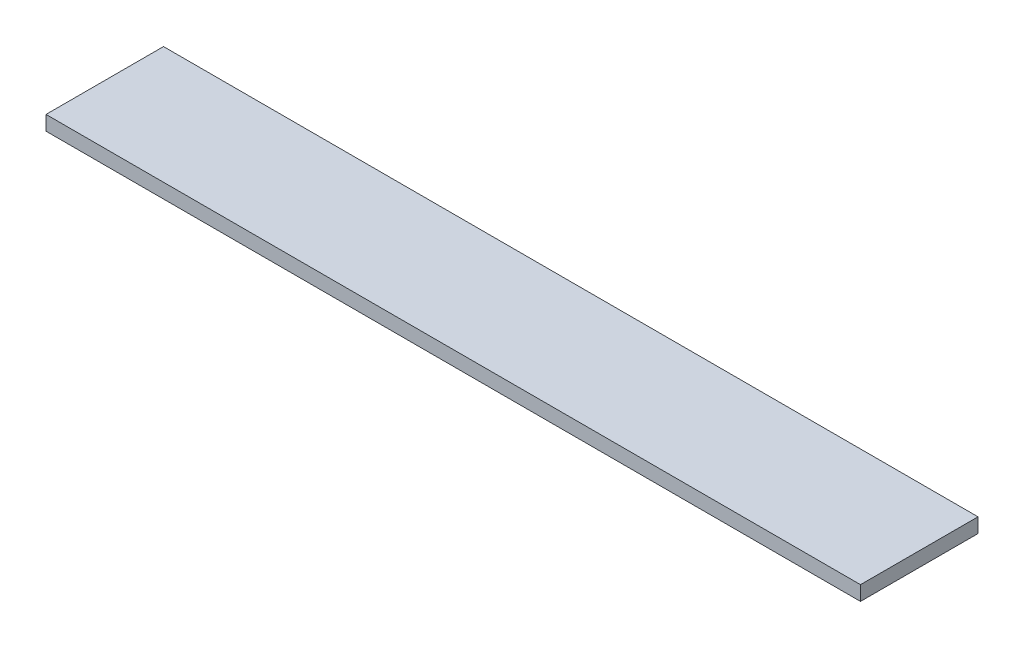
ISO-10303-21;
HEADER;
FILE_DESCRIPTION(('STEP AP214'),'2;1');
FILE_NAME('part.step','',(''),(''),'','','');
FILE_SCHEMA(('AUTOMOTIVE_DESIGN { 1 0 10303 214 1 1 1 1 }'));
ENDSEC;
DATA;
#1=APPLICATION_CONTEXT('core data for automotive mechanical design processes');
#2=APPLICATION_PROTOCOL_DEFINITION('international standard','automotive_design',2000,#1);
#3=PRODUCT_CONTEXT('',#1,'mechanical');
#4=PRODUCT('Part','Part','',(#3));
#5=PRODUCT_RELATED_PRODUCT_CATEGORY('part','',(#4));
#6=PRODUCT_DEFINITION_FORMATION('','',#4);
#7=PRODUCT_DEFINITION_CONTEXT('part definition',#1,'design');
#8=PRODUCT_DEFINITION('design','',#6,#7);
#9=PRODUCT_DEFINITION_SHAPE('','',#8);
#10=(LENGTH_UNIT() NAMED_UNIT(*) SI_UNIT(.MILLI.,.METRE.));
#11=(NAMED_UNIT(*) PLANE_ANGLE_UNIT() SI_UNIT($,.RADIAN.));
#12=(NAMED_UNIT(*) SI_UNIT($,.STERADIAN.) SOLID_ANGLE_UNIT());
#13=UNCERTAINTY_MEASURE_WITH_UNIT(LENGTH_MEASURE(1.E-05),#10,'distance_accuracy_value','');
#14=(GEOMETRIC_REPRESENTATION_CONTEXT(3) GLOBAL_UNCERTAINTY_ASSIGNED_CONTEXT((#13)) GLOBAL_UNIT_ASSIGNED_CONTEXT((#10,
#11,#12)) REPRESENTATION_CONTEXT('',''));
#15=CARTESIAN_POINT('',(0.,0.,0.));
#16=DIRECTION('',(0.,0.,1.));
#17=DIRECTION('',(1.,0.,0.));
#18=AXIS2_PLACEMENT_3D('',#15,#16,#17);
#19=CARTESIAN_POINT('',(0.,0.,25.654));
#20=DIRECTION('',(1.,0.,0.));
#21=DIRECTION('',(0.,1.,0.));
#22=AXIS2_PLACEMENT_3D('',#19,#20,#21);
#23=PLANE('',#22);
#24=DIRECTION('',(0.,-1.,0.));
#25=VECTOR('',#24,1.);
#26=CARTESIAN_POINT('',(0.,0.,0.));
#27=LINE('',#26,#25);
#28=CARTESIAN_POINT('',(0.,0.,0.));
#29=VERTEX_POINT('',#28);
#30=CARTESIAN_POINT('',(0.,-3.175,0.));
#31=VERTEX_POINT('',#30);
#32=EDGE_CURVE('E96',#29,#31,#27,.T.);
#33=ORIENTED_EDGE('',*,*,#32,.T.);
#34=DIRECTION('',(0.,0.,-1.));
#35=VECTOR('',#34,1.);
#36=CARTESIAN_POINT('',(0.,-3.175,25.654));
#37=LINE('',#36,#35);
#38=CARTESIAN_POINT('',(0.,-3.175,25.654));
#39=VERTEX_POINT('',#38);
#40=EDGE_CURVE('E11',#39,#31,#37,.T.);
#41=ORIENTED_EDGE('',*,*,#40,.F.);
#42=DIRECTION('',(0.,-1.,0.));
#43=VECTOR('',#42,1.);
#44=CARTESIAN_POINT('',(0.,0.,25.654));
#45=LINE('',#44,#43);
#46=CARTESIAN_POINT('',(0.,0.,25.654));
#47=VERTEX_POINT('',#46);
#48=EDGE_CURVE('E84',#47,#39,#45,.T.);
#49=ORIENTED_EDGE('',*,*,#48,.F.);
#50=DIRECTION('',(0.,0.,-1.));
#51=VECTOR('',#50,1.);
#52=CARTESIAN_POINT('',(0.,0.,25.654));
#53=LINE('',#52,#51);
#54=EDGE_CURVE('E92',#47,#29,#53,.T.);
#55=ORIENTED_EDGE('',*,*,#54,.T.);
#56=EDGE_LOOP('',(#33,#41,#49,#55));
#57=FACE_BOUND('',#56,.T.);
#58=ADVANCED_FACE('F33',(#57),#23,.F.);
#59=CARTESIAN_POINT('',(0.,-3.175,25.654));
#60=DIRECTION('',(0.,1.,0.));
#61=DIRECTION('',(0.,0.,1.));
#62=AXIS2_PLACEMENT_3D('',#59,#60,#61);
#63=PLANE('',#62);
#64=DIRECTION('',(1.,0.,0.));
#65=VECTOR('',#64,1.);
#66=CARTESIAN_POINT('',(0.,-3.175,0.));
#67=LINE('',#66,#65);
#68=CARTESIAN_POINT('',(177.8,-3.175,0.));
#69=VERTEX_POINT('',#68);
#70=EDGE_CURVE('E88',#31,#69,#67,.T.);
#71=ORIENTED_EDGE('',*,*,#70,.T.);
#72=DIRECTION('',(0.,0.,-1.));
#73=VECTOR('',#72,1.);
#74=CARTESIAN_POINT('',(177.8,-3.175,25.654));
#75=LINE('',#74,#73);
#76=CARTESIAN_POINT('',(177.8,-3.175,25.654));
#77=VERTEX_POINT('',#76);
#78=EDGE_CURVE('E41',#77,#69,#75,.T.);
#79=ORIENTED_EDGE('',*,*,#78,.F.);
#80=DIRECTION('',(1.,0.,0.));
#81=VECTOR('',#80,1.);
#82=CARTESIAN_POINT('',(0.,-3.175,25.654));
#83=LINE('',#82,#81);
#84=EDGE_CURVE('E79',#39,#77,#83,.T.);
#85=ORIENTED_EDGE('',*,*,#84,.F.);
#86=ORIENTED_EDGE('',*,*,#40,.T.);
#87=EDGE_LOOP('',(#71,#79,#85,#86));
#88=FACE_BOUND('',#87,.T.);
#89=ADVANCED_FACE('F87',(#88),#63,.F.);
#90=CARTESIAN_POINT('',(177.8,0.,25.654));
#91=DIRECTION('',(-1.,0.,0.));
#92=DIRECTION('',(0.,0.,1.));
#93=AXIS2_PLACEMENT_3D('',#90,#91,#92);
#94=PLANE('',#93);
#95=DIRECTION('',(0.,1.,0.));
#96=VECTOR('',#95,1.);
#97=CARTESIAN_POINT('',(177.8,0.,0.));
#98=LINE('',#97,#96);
#99=CARTESIAN_POINT('',(177.8,0.,0.));
#100=VERTEX_POINT('',#99);
#101=EDGE_CURVE('E66',#69,#100,#98,.T.);
#102=ORIENTED_EDGE('',*,*,#101,.T.);
#103=DIRECTION('',(0.,0.,-1.));
#104=VECTOR('',#103,1.);
#105=CARTESIAN_POINT('',(177.8,0.,25.654));
#106=LINE('',#105,#104);
#107=CARTESIAN_POINT('',(177.8,0.,25.654));
#108=VERTEX_POINT('',#107);
#109=EDGE_CURVE('E89',#108,#100,#106,.T.);
#110=ORIENTED_EDGE('',*,*,#109,.F.);
#111=DIRECTION('',(0.,1.,0.));
#112=VECTOR('',#111,1.);
#113=CARTESIAN_POINT('',(177.8,0.,25.654));
#114=LINE('',#113,#112);
#115=EDGE_CURVE('E82',#77,#108,#114,.T.);
#116=ORIENTED_EDGE('',*,*,#115,.F.);
#117=ORIENTED_EDGE('',*,*,#78,.T.);
#118=EDGE_LOOP('',(#102,#110,#116,#117));
#119=FACE_BOUND('',#118,.T.);
#120=ADVANCED_FACE('F90',(#119),#94,.F.);
#121=CARTESIAN_POINT('',(0.,0.,25.654));
#122=DIRECTION('',(0.,-1.,0.));
#123=DIRECTION('',(0.,0.,-1.));
#124=AXIS2_PLACEMENT_3D('',#121,#122,#123);
#125=PLANE('',#124);
#126=DIRECTION('',(-1.,0.,0.));
#127=VECTOR('',#126,1.);
#128=CARTESIAN_POINT('',(0.,0.,0.));
#129=LINE('',#128,#127);
#130=EDGE_CURVE('E72',#100,#29,#129,.T.);
#131=ORIENTED_EDGE('',*,*,#130,.T.);
#132=ORIENTED_EDGE('',*,*,#54,.F.);
#133=DIRECTION('',(-1.,0.,0.));
#134=VECTOR('',#133,1.);
#135=CARTESIAN_POINT('',(0.,0.,25.654));
#136=LINE('',#135,#134);
#137=EDGE_CURVE('E49',#108,#47,#136,.T.);
#138=ORIENTED_EDGE('',*,*,#137,.F.);
#139=ORIENTED_EDGE('',*,*,#109,.T.);
#140=EDGE_LOOP('',(#131,#132,#138,#139));
#141=FACE_BOUND('',#140,.T.);
#142=ADVANCED_FACE('F103',(#141),#125,.F.);
#143=CARTESIAN_POINT('',(0.,0.,25.654));
#144=DIRECTION('',(0.,0.,1.));
#145=DIRECTION('',(1.,0.,0.));
#146=AXIS2_PLACEMENT_3D('',#143,#144,#145);
#147=PLANE('',#146);
#148=ORIENTED_EDGE('',*,*,#48,.T.);
#149=ORIENTED_EDGE('',*,*,#84,.T.);
#150=ORIENTED_EDGE('',*,*,#115,.T.);
#151=ORIENTED_EDGE('',*,*,#137,.T.);
#152=EDGE_LOOP('',(#148,#149,#150,#151));
#153=FACE_BOUND('',#152,.T.);
#154=ADVANCED_FACE('F80',(#153),#147,.T.);
#155=CARTESIAN_POINT('',(0.,0.,0.));
#156=DIRECTION('',(0.,0.,1.));
#157=DIRECTION('',(1.,0.,0.));
#158=AXIS2_PLACEMENT_3D('',#155,#156,#157);
#159=PLANE('',#158);
#160=ORIENTED_EDGE('',*,*,#32,.F.);
#161=ORIENTED_EDGE('',*,*,#130,.F.);
#162=ORIENTED_EDGE('',*,*,#101,.F.);
#163=ORIENTED_EDGE('',*,*,#70,.F.);
#164=EDGE_LOOP('',(#160,#161,#162,#163));
#165=FACE_BOUND('',#164,.T.);
#166=ADVANCED_FACE('F106',(#165),#159,.F.);
#167=CLOSED_SHELL('',(#58,#89,#120,#142,#154,#166));
#168=MANIFOLD_SOLID_BREP('B2',#167);
#169=ADVANCED_BREP_SHAPE_REPRESENTATION('',(#18,#168),#14);
#170=SHAPE_DEFINITION_REPRESENTATION(#9,#169);
ENDSEC;
END-ISO-10303-21;
